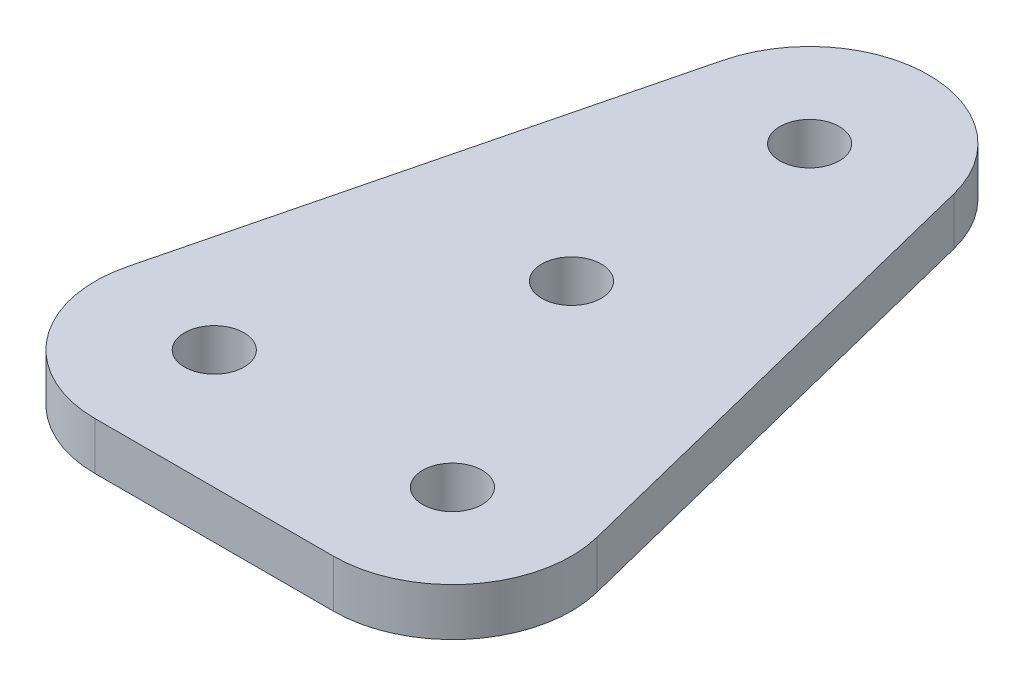
ISO-10303-21;
HEADER;
FILE_DESCRIPTION(('STEP AP214'),'2;1');
FILE_NAME('part.step','',(''),(''),'','','');
FILE_SCHEMA(('AUTOMOTIVE_DESIGN { 1 0 10303 214 1 1 1 1 }'));
ENDSEC;
DATA;
#1=APPLICATION_CONTEXT('core data for automotive mechanical design processes');
#2=APPLICATION_PROTOCOL_DEFINITION('international standard','automotive_design',2000,#1);
#3=PRODUCT_CONTEXT('',#1,'mechanical');
#4=PRODUCT('Part','Part','',(#3));
#5=PRODUCT_RELATED_PRODUCT_CATEGORY('part','',(#4));
#6=PRODUCT_DEFINITION_FORMATION('','',#4);
#7=PRODUCT_DEFINITION_CONTEXT('part definition',#1,'design');
#8=PRODUCT_DEFINITION('design','',#6,#7);
#9=PRODUCT_DEFINITION_SHAPE('','',#8);
#10=(LENGTH_UNIT() NAMED_UNIT(*) SI_UNIT(.MILLI.,.METRE.));
#11=(NAMED_UNIT(*) PLANE_ANGLE_UNIT() SI_UNIT($,.RADIAN.));
#12=(NAMED_UNIT(*) SI_UNIT($,.STERADIAN.) SOLID_ANGLE_UNIT());
#13=UNCERTAINTY_MEASURE_WITH_UNIT(LENGTH_MEASURE(1.E-05),#10,'distance_accuracy_value','');
#14=(GEOMETRIC_REPRESENTATION_CONTEXT(3) GLOBAL_UNCERTAINTY_ASSIGNED_CONTEXT((#13)) GLOBAL_UNIT_ASSIGNED_CONTEXT((#10,
#11,#12)) REPRESENTATION_CONTEXT('',''));
#15=CARTESIAN_POINT('',(0.,0.,0.));
#16=DIRECTION('',(0.,0.,1.));
#17=DIRECTION('',(1.,0.,0.));
#18=AXIS2_PLACEMENT_3D('',#15,#16,#17);
#19=CARTESIAN_POINT('',(-9.99999999999999,4.,0.));
#20=DIRECTION('',(0.,1.,0.));
#21=DIRECTION('',(0.,0.,1.));
#22=AXIS2_PLACEMENT_3D('',#19,#20,#21);
#23=PLANE('',#22);
#24=CARTESIAN_POINT('',(0.,4.,-20.));
#25=DIRECTION('',(0.,1.,0.));
#26=DIRECTION('',(0.,0.,1.));
#27=AXIS2_PLACEMENT_3D('',#24,#25,#26);
#28=CIRCLE('',#27,2.5);
#29=CARTESIAN_POINT('',(0.,4.,-17.5));
#30=VERTEX_POINT('',#29);
#31=EDGE_CURVE('E188',#30,#30,#28,.T.);
#32=ORIENTED_EDGE('',*,*,#31,.F.);
#33=EDGE_LOOP('',(#32));
#34=FACE_BOUND('',#33,.T.);
#35=CARTESIAN_POINT('',(10.,4.,0.));
#36=DIRECTION('',(0.,1.,0.));
#37=DIRECTION('',(0.,0.,1.));
#38=AXIS2_PLACEMENT_3D('',#35,#36,#37);
#39=CIRCLE('',#38,2.5);
#40=CARTESIAN_POINT('',(10.,4.,2.5));
#41=VERTEX_POINT('',#40);
#42=EDGE_CURVE('E121',#41,#41,#39,.T.);
#43=ORIENTED_EDGE('',*,*,#42,.F.);
#44=EDGE_LOOP('',(#43));
#45=FACE_BOUND('',#44,.T.);
#46=CARTESIAN_POINT('',(-9.99999999999999,4.,0.));
#47=DIRECTION('',(0.,1.,0.));
#48=DIRECTION('',(0.,0.,1.));
#49=AXIS2_PLACEMENT_3D('',#46,#47,#48);
#50=CIRCLE('',#49,10.);
#51=CARTESIAN_POINT('',(-19.7014250014533,4.,-2.42535625036333));
#52=VERTEX_POINT('',#51);
#53=CARTESIAN_POINT('',(-9.99999999999999,4.,10.));
#54=VERTEX_POINT('',#53);
#55=EDGE_CURVE('E128',#52,#54,#50,.T.);
#56=ORIENTED_EDGE('',*,*,#55,.T.);
#57=DIRECTION('',(1.,0.,0.));
#58=VECTOR('',#57,1.);
#59=CARTESIAN_POINT('',(-9.99999999999999,4.,10.));
#60=LINE('',#59,#58);
#61=CARTESIAN_POINT('',(10.,4.,10.));
#62=VERTEX_POINT('',#61);
#63=EDGE_CURVE('E86',#54,#62,#60,.T.);
#64=ORIENTED_EDGE('',*,*,#63,.T.);
#65=CARTESIAN_POINT('',(10.,4.,0.));
#66=DIRECTION('',(0.,1.,0.));
#67=DIRECTION('',(0.,0.,1.));
#68=AXIS2_PLACEMENT_3D('',#65,#66,#67);
#69=CIRCLE('',#68,10.);
#70=CARTESIAN_POINT('',(19.7014250014533,4.,-2.42535625036333));
#71=VERTEX_POINT('',#70);
#72=EDGE_CURVE('E99',#62,#71,#69,.T.);
#73=ORIENTED_EDGE('',*,*,#72,.T.);
#74=DIRECTION('',(-0.242535625036333,0.,-0.970142500145332));
#75=VECTOR('',#74,1.);
#76=CARTESIAN_POINT('',(9.70142500145332,4.,-42.4253562503633));
#77=LINE('',#76,#75);
#78=CARTESIAN_POINT('',(9.70142500145332,4.,-42.4253562503633));
#79=VERTEX_POINT('',#78);
#80=EDGE_CURVE('E93',#71,#79,#77,.T.);
#81=ORIENTED_EDGE('',*,*,#80,.T.);
#82=CARTESIAN_POINT('',(0.,4.,-40.));
#83=DIRECTION('',(0.,1.,0.));
#84=DIRECTION('',(0.,0.,1.));
#85=AXIS2_PLACEMENT_3D('',#82,#83,#84);
#86=CIRCLE('',#85,10.);
#87=CARTESIAN_POINT('',(-9.70142500145332,4.,-42.4253562503633));
#88=VERTEX_POINT('',#87);
#89=EDGE_CURVE('E97',#79,#88,#86,.T.);
#90=ORIENTED_EDGE('',*,*,#89,.T.);
#91=DIRECTION('',(-0.242535625036333,0.,0.970142500145332));
#92=VECTOR('',#91,1.);
#93=CARTESIAN_POINT('',(-9.70142500145332,4.,-42.4253562503633));
#94=LINE('',#93,#92);
#95=EDGE_CURVE('E49',#88,#52,#94,.T.);
#96=ORIENTED_EDGE('',*,*,#95,.T.);
#97=EDGE_LOOP('',(#56,#64,#73,#81,#90,#96));
#98=FACE_BOUND('',#97,.T.);
#99=CARTESIAN_POINT('',(-9.99999999999999,4.,0.));
#100=DIRECTION('',(0.,1.,0.));
#101=DIRECTION('',(0.,0.,-1.));
#102=AXIS2_PLACEMENT_3D('',#99,#100,#101);
#103=CIRCLE('',#102,2.5);
#104=CARTESIAN_POINT('',(-9.99999999999999,4.,-2.5));
#105=VERTEX_POINT('',#104);
#106=EDGE_CURVE('E194',#105,#105,#103,.T.);
#107=ORIENTED_EDGE('',*,*,#106,.F.);
#108=EDGE_LOOP('',(#107));
#109=FACE_BOUND('',#108,.T.);
#110=CARTESIAN_POINT('',(0.,4.,-40.));
#111=DIRECTION('',(0.,1.,0.));
#112=DIRECTION('',(0.,0.,1.));
#113=AXIS2_PLACEMENT_3D('',#110,#111,#112);
#114=CIRCLE('',#113,2.5);
#115=CARTESIAN_POINT('',(0.,4.,-37.5));
#116=VERTEX_POINT('',#115);
#117=EDGE_CURVE('E179',#116,#116,#114,.T.);
#118=ORIENTED_EDGE('',*,*,#117,.F.);
#119=EDGE_LOOP('',(#118));
#120=FACE_BOUND('',#119,.T.);
#121=ADVANCED_FACE('F32',(#34,#45,#98,#109,#120),#23,.T.);
#122=CARTESIAN_POINT('',(-9.99999999999999,0.,0.));
#123=DIRECTION('',(0.,1.,0.));
#124=DIRECTION('',(0.,0.,1.));
#125=AXIS2_PLACEMENT_3D('',#122,#123,#124);
#126=PLANE('',#125);
#127=CARTESIAN_POINT('',(-9.99999999999999,0.,0.));
#128=DIRECTION('',(0.,1.,0.));
#129=DIRECTION('',(0.,0.,1.));
#130=AXIS2_PLACEMENT_3D('',#127,#128,#129);
#131=CIRCLE('',#130,10.);
#132=CARTESIAN_POINT('',(-19.7014250014533,0.,-2.42535625036333));
#133=VERTEX_POINT('',#132);
#134=CARTESIAN_POINT('',(-9.99999999999999,0.,10.));
#135=VERTEX_POINT('',#134);
#136=EDGE_CURVE('E117',#133,#135,#131,.T.);
#137=ORIENTED_EDGE('',*,*,#136,.F.);
#138=DIRECTION('',(-0.242535625036333,0.,0.970142500145332));
#139=VECTOR('',#138,1.);
#140=CARTESIAN_POINT('',(-9.70142500145332,0.,-42.4253562503633));
#141=LINE('',#140,#139);
#142=CARTESIAN_POINT('',(-9.70142500145332,0.,-42.4253562503633));
#143=VERTEX_POINT('',#142);
#144=EDGE_CURVE('E78',#143,#133,#141,.T.);
#145=ORIENTED_EDGE('',*,*,#144,.F.);
#146=CARTESIAN_POINT('',(0.,0.,-40.));
#147=DIRECTION('',(0.,1.,0.));
#148=DIRECTION('',(0.,0.,1.));
#149=AXIS2_PLACEMENT_3D('',#146,#147,#148);
#150=CIRCLE('',#149,10.);
#151=CARTESIAN_POINT('',(9.70142500145332,0.,-42.4253562503633));
#152=VERTEX_POINT('',#151);
#153=EDGE_CURVE('E72',#152,#143,#150,.T.);
#154=ORIENTED_EDGE('',*,*,#153,.F.);
#155=DIRECTION('',(-0.242535625036333,0.,-0.970142500145332));
#156=VECTOR('',#155,1.);
#157=CARTESIAN_POINT('',(9.70142500145332,0.,-42.4253562503633));
#158=LINE('',#157,#156);
#159=CARTESIAN_POINT('',(19.7014250014533,0.,-2.42535625036333));
#160=VERTEX_POINT('',#159);
#161=EDGE_CURVE('E107',#160,#152,#158,.T.);
#162=ORIENTED_EDGE('',*,*,#161,.F.);
#163=CARTESIAN_POINT('',(10.,0.,0.));
#164=DIRECTION('',(0.,1.,0.));
#165=DIRECTION('',(0.,0.,1.));
#166=AXIS2_PLACEMENT_3D('',#163,#164,#165);
#167=CIRCLE('',#166,10.);
#168=CARTESIAN_POINT('',(10.,0.,10.));
#169=VERTEX_POINT('',#168);
#170=EDGE_CURVE('E123',#169,#160,#167,.T.);
#171=ORIENTED_EDGE('',*,*,#170,.F.);
#172=DIRECTION('',(1.,0.,0.));
#173=VECTOR('',#172,1.);
#174=CARTESIAN_POINT('',(-9.99999999999999,0.,10.));
#175=LINE('',#174,#173);
#176=EDGE_CURVE('E120',#135,#169,#175,.T.);
#177=ORIENTED_EDGE('',*,*,#176,.F.);
#178=EDGE_LOOP('',(#137,#145,#154,#162,#171,#177));
#179=FACE_BOUND('',#178,.T.);
#180=CARTESIAN_POINT('',(10.,0.,0.));
#181=DIRECTION('',(0.,1.,0.));
#182=DIRECTION('',(0.,0.,1.));
#183=AXIS2_PLACEMENT_3D('',#180,#181,#182);
#184=CIRCLE('',#183,2.5);
#185=CARTESIAN_POINT('',(10.,0.,2.5));
#186=VERTEX_POINT('',#185);
#187=EDGE_CURVE('E197',#186,#186,#184,.T.);
#188=ORIENTED_EDGE('',*,*,#187,.T.);
#189=EDGE_LOOP('',(#188));
#190=FACE_BOUND('',#189,.T.);
#191=CARTESIAN_POINT('',(-9.99999999999999,0.,0.));
#192=DIRECTION('',(0.,1.,0.));
#193=DIRECTION('',(0.,0.,-1.));
#194=AXIS2_PLACEMENT_3D('',#191,#192,#193);
#195=CIRCLE('',#194,2.5);
#196=CARTESIAN_POINT('',(-9.99999999999999,0.,-2.5));
#197=VERTEX_POINT('',#196);
#198=EDGE_CURVE('E191',#197,#197,#195,.T.);
#199=ORIENTED_EDGE('',*,*,#198,.T.);
#200=EDGE_LOOP('',(#199));
#201=FACE_BOUND('',#200,.T.);
#202=CARTESIAN_POINT('',(0.,0.,-20.));
#203=DIRECTION('',(0.,1.,0.));
#204=DIRECTION('',(0.,0.,1.));
#205=AXIS2_PLACEMENT_3D('',#202,#203,#204);
#206=CIRCLE('',#205,2.5);
#207=CARTESIAN_POINT('',(0.,0.,-17.5));
#208=VERTEX_POINT('',#207);
#209=EDGE_CURVE('E185',#208,#208,#206,.T.);
#210=ORIENTED_EDGE('',*,*,#209,.T.);
#211=EDGE_LOOP('',(#210));
#212=FACE_BOUND('',#211,.T.);
#213=CARTESIAN_POINT('',(0.,0.,-40.));
#214=DIRECTION('',(0.,1.,0.));
#215=DIRECTION('',(0.,0.,1.));
#216=AXIS2_PLACEMENT_3D('',#213,#214,#215);
#217=CIRCLE('',#216,2.5);
#218=CARTESIAN_POINT('',(0.,0.,-37.5));
#219=VERTEX_POINT('',#218);
#220=EDGE_CURVE('E182',#219,#219,#217,.T.);
#221=ORIENTED_EDGE('',*,*,#220,.T.);
#222=EDGE_LOOP('',(#221));
#223=FACE_BOUND('',#222,.T.);
#224=ADVANCED_FACE('F137',(#179,#190,#201,#212,#223),#126,.F.);
#225=CARTESIAN_POINT('',(-9.99999999999999,4.,0.));
#226=DIRECTION('',(0.,-1.,0.));
#227=DIRECTION('',(0.,0.,-1.));
#228=AXIS2_PLACEMENT_3D('',#225,#226,#227);
#229=CYLINDRICAL_SURFACE('',#228,10.);
#230=ORIENTED_EDGE('',*,*,#136,.T.);
#231=DIRECTION('',(0.,-1.,0.));
#232=VECTOR('',#231,1.);
#233=CARTESIAN_POINT('',(-9.99999999999999,4.,10.));
#234=LINE('',#233,#232);
#235=EDGE_CURVE('E11',#54,#135,#234,.T.);
#236=ORIENTED_EDGE('',*,*,#235,.F.);
#237=ORIENTED_EDGE('',*,*,#55,.F.);
#238=DIRECTION('',(0.,-1.,0.));
#239=VECTOR('',#238,1.);
#240=CARTESIAN_POINT('',(-19.7014250014533,4.,-2.42535625036333));
#241=LINE('',#240,#239);
#242=EDGE_CURVE('E113',#52,#133,#241,.T.);
#243=ORIENTED_EDGE('',*,*,#242,.T.);
#244=EDGE_LOOP('',(#230,#236,#237,#243));
#245=FACE_BOUND('',#244,.T.);
#246=ADVANCED_FACE('F34',(#245),#229,.T.);
#247=CARTESIAN_POINT('',(-9.99999999999999,4.,10.));
#248=DIRECTION('',(0.,0.,-1.));
#249=DIRECTION('',(-1.,0.,0.));
#250=AXIS2_PLACEMENT_3D('',#247,#248,#249);
#251=PLANE('',#250);
#252=ORIENTED_EDGE('',*,*,#176,.T.);
#253=DIRECTION('',(0.,-1.,0.));
#254=VECTOR('',#253,1.);
#255=CARTESIAN_POINT('',(10.,4.,10.));
#256=LINE('',#255,#254);
#257=EDGE_CURVE('E41',#62,#169,#256,.T.);
#258=ORIENTED_EDGE('',*,*,#257,.F.);
#259=ORIENTED_EDGE('',*,*,#63,.F.);
#260=ORIENTED_EDGE('',*,*,#235,.T.);
#261=EDGE_LOOP('',(#252,#258,#259,#260));
#262=FACE_BOUND('',#261,.T.);
#263=ADVANCED_FACE('F255',(#262),#251,.F.);
#264=CARTESIAN_POINT('',(10.,4.,0.));
#265=DIRECTION('',(0.,-1.,0.));
#266=DIRECTION('',(0.,0.,-1.));
#267=AXIS2_PLACEMENT_3D('',#264,#265,#266);
#268=CYLINDRICAL_SURFACE('',#267,10.);
#269=ORIENTED_EDGE('',*,*,#170,.T.);
#270=DIRECTION('',(0.,-1.,0.));
#271=VECTOR('',#270,1.);
#272=CARTESIAN_POINT('',(19.7014250014533,4.,-2.42535625036333));
#273=LINE('',#272,#271);
#274=EDGE_CURVE('E108',#71,#160,#273,.T.);
#275=ORIENTED_EDGE('',*,*,#274,.F.);
#276=ORIENTED_EDGE('',*,*,#72,.F.);
#277=ORIENTED_EDGE('',*,*,#257,.T.);
#278=EDGE_LOOP('',(#269,#275,#276,#277));
#279=FACE_BOUND('',#278,.T.);
#280=ADVANCED_FACE('F134',(#279),#268,.T.);
#281=CARTESIAN_POINT('',(9.70142500145332,4.,-42.4253562503633));
#282=DIRECTION('',(-0.970142500145332,0.,0.242535625036333));
#283=DIRECTION('',(0.242535625036333,0.,0.970142500145332));
#284=AXIS2_PLACEMENT_3D('',#281,#282,#283);
#285=PLANE('',#284);
#286=ORIENTED_EDGE('',*,*,#161,.T.);
#287=DIRECTION('',(0.,-1.,0.));
#288=VECTOR('',#287,1.);
#289=CARTESIAN_POINT('',(9.70142500145332,4.,-42.4253562503633));
#290=LINE('',#289,#288);
#291=EDGE_CURVE('E104',#79,#152,#290,.T.);
#292=ORIENTED_EDGE('',*,*,#291,.F.);
#293=ORIENTED_EDGE('',*,*,#80,.F.);
#294=ORIENTED_EDGE('',*,*,#274,.T.);
#295=EDGE_LOOP('',(#286,#292,#293,#294));
#296=FACE_BOUND('',#295,.T.);
#297=ADVANCED_FACE('F105',(#296),#285,.F.);
#298=CARTESIAN_POINT('',(0.,4.,-40.));
#299=DIRECTION('',(0.,-1.,0.));
#300=DIRECTION('',(0.,0.,-1.));
#301=AXIS2_PLACEMENT_3D('',#298,#299,#300);
#302=CYLINDRICAL_SURFACE('',#301,10.);
#303=ORIENTED_EDGE('',*,*,#153,.T.);
#304=DIRECTION('',(0.,-1.,0.));
#305=VECTOR('',#304,1.);
#306=CARTESIAN_POINT('',(-9.70142500145332,4.,-42.4253562503633));
#307=LINE('',#306,#305);
#308=EDGE_CURVE('E109',#88,#143,#307,.T.);
#309=ORIENTED_EDGE('',*,*,#308,.F.);
#310=ORIENTED_EDGE('',*,*,#89,.F.);
#311=ORIENTED_EDGE('',*,*,#291,.T.);
#312=EDGE_LOOP('',(#303,#309,#310,#311));
#313=FACE_BOUND('',#312,.T.);
#314=ADVANCED_FACE('F111',(#313),#302,.T.);
#315=CARTESIAN_POINT('',(-9.70142500145332,4.,-42.4253562503633));
#316=DIRECTION('',(0.970142500145332,0.,0.242535625036333));
#317=DIRECTION('',(0.242535625036333,0.,-0.970142500145332));
#318=AXIS2_PLACEMENT_3D('',#315,#316,#317);
#319=PLANE('',#318);
#320=ORIENTED_EDGE('',*,*,#144,.T.);
#321=ORIENTED_EDGE('',*,*,#242,.F.);
#322=ORIENTED_EDGE('',*,*,#95,.F.);
#323=ORIENTED_EDGE('',*,*,#308,.T.);
#324=EDGE_LOOP('',(#320,#321,#322,#323));
#325=FACE_BOUND('',#324,.T.);
#326=ADVANCED_FACE('F142',(#325),#319,.F.);
#327=CARTESIAN_POINT('',(10.,4.,0.));
#328=DIRECTION('',(0.,-1.,0.));
#329=DIRECTION('',(0.,0.,-1.));
#330=AXIS2_PLACEMENT_3D('',#327,#328,#329);
#331=CYLINDRICAL_SURFACE('',#330,2.5);
#332=ORIENTED_EDGE('',*,*,#42,.T.);
#333=EDGE_LOOP('',(#332));
#334=FACE_BOUND('',#333,.T.);
#335=ORIENTED_EDGE('',*,*,#187,.F.);
#336=EDGE_LOOP('',(#335));
#337=FACE_BOUND('',#336,.T.);
#338=ADVANCED_FACE('F144',(#334,#337),#331,.F.);
#339=CARTESIAN_POINT('',(-9.99999999999999,4.,0.));
#340=DIRECTION('',(0.,-1.,0.));
#341=DIRECTION('',(0.,0.,-1.));
#342=AXIS2_PLACEMENT_3D('',#339,#340,#341);
#343=CYLINDRICAL_SURFACE('',#342,2.5);
#344=ORIENTED_EDGE('',*,*,#106,.T.);
#345=EDGE_LOOP('',(#344));
#346=FACE_BOUND('',#345,.T.);
#347=ORIENTED_EDGE('',*,*,#198,.F.);
#348=EDGE_LOOP('',(#347));
#349=FACE_BOUND('',#348,.T.);
#350=ADVANCED_FACE('F150',(#346,#349),#343,.F.);
#351=CARTESIAN_POINT('',(0.,4.,-20.));
#352=DIRECTION('',(0.,-1.,0.));
#353=DIRECTION('',(0.,0.,-1.));
#354=AXIS2_PLACEMENT_3D('',#351,#352,#353);
#355=CYLINDRICAL_SURFACE('',#354,2.5);
#356=ORIENTED_EDGE('',*,*,#31,.T.);
#357=EDGE_LOOP('',(#356));
#358=FACE_BOUND('',#357,.T.);
#359=ORIENTED_EDGE('',*,*,#209,.F.);
#360=EDGE_LOOP('',(#359));
#361=FACE_BOUND('',#360,.T.);
#362=ADVANCED_FACE('F166',(#358,#361),#355,.F.);
#363=CARTESIAN_POINT('',(0.,4.,-40.));
#364=DIRECTION('',(0.,-1.,0.));
#365=DIRECTION('',(0.,0.,-1.));
#366=AXIS2_PLACEMENT_3D('',#363,#364,#365);
#367=CYLINDRICAL_SURFACE('',#366,2.5);
#368=ORIENTED_EDGE('',*,*,#117,.T.);
#369=EDGE_LOOP('',(#368));
#370=FACE_BOUND('',#369,.T.);
#371=ORIENTED_EDGE('',*,*,#220,.F.);
#372=EDGE_LOOP('',(#371));
#373=FACE_BOUND('',#372,.T.);
#374=ADVANCED_FACE('F170',(#370,#373),#367,.F.);
#375=CLOSED_SHELL('',(#121,#224,#246,#263,#280,#297,#314,#326,#338,#350,#362,#374));
#376=MANIFOLD_SOLID_BREP('B2',#375);
#377=ADVANCED_BREP_SHAPE_REPRESENTATION('',(#18,#376),#14);
#378=SHAPE_DEFINITION_REPRESENTATION(#9,#377);
ENDSEC;
END-ISO-10303-21;
